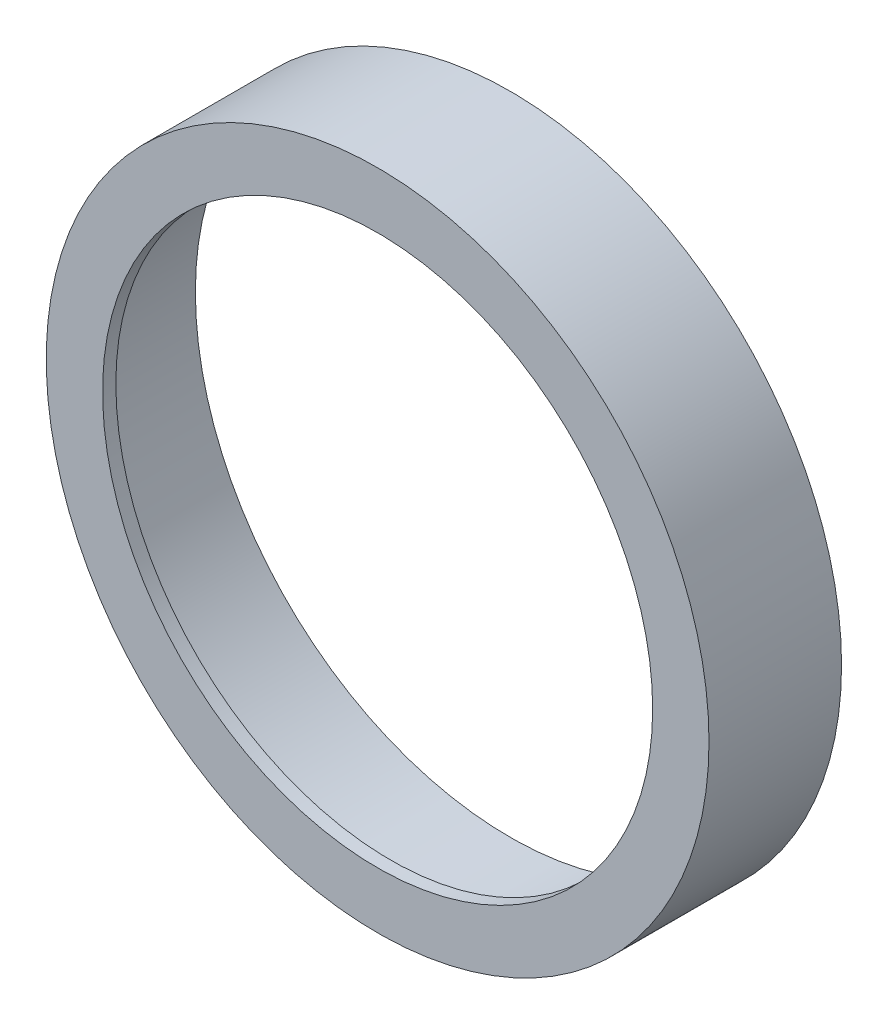
ISO-10303-21;
HEADER;
FILE_DESCRIPTION(('STEP AP214'),'2;1');
FILE_NAME('part.step','',(''),(''),'','','');
FILE_SCHEMA(('AUTOMOTIVE_DESIGN { 1 0 10303 214 1 1 1 1 }'));
ENDSEC;
DATA;
#1=APPLICATION_CONTEXT('core data for automotive mechanical design processes');
#2=APPLICATION_PROTOCOL_DEFINITION('international standard','automotive_design',2000,#1);
#3=PRODUCT_CONTEXT('',#1,'mechanical');
#4=PRODUCT('Part','Part','',(#3));
#5=PRODUCT_RELATED_PRODUCT_CATEGORY('part','',(#4));
#6=PRODUCT_DEFINITION_FORMATION('','',#4);
#7=PRODUCT_DEFINITION_CONTEXT('part definition',#1,'design');
#8=PRODUCT_DEFINITION('design','',#6,#7);
#9=PRODUCT_DEFINITION_SHAPE('','',#8);
#10=(LENGTH_UNIT() NAMED_UNIT(*) SI_UNIT(.MILLI.,.METRE.));
#11=(NAMED_UNIT(*) PLANE_ANGLE_UNIT() SI_UNIT($,.RADIAN.));
#12=(NAMED_UNIT(*) SI_UNIT($,.STERADIAN.) SOLID_ANGLE_UNIT());
#13=UNCERTAINTY_MEASURE_WITH_UNIT(LENGTH_MEASURE(1.E-05),#10,'distance_accuracy_value','');
#14=(GEOMETRIC_REPRESENTATION_CONTEXT(3) GLOBAL_UNCERTAINTY_ASSIGNED_CONTEXT((#13)) GLOBAL_UNIT_ASSIGNED_CONTEXT((#10,
#11,#12)) REPRESENTATION_CONTEXT('',''));
#15=CARTESIAN_POINT('',(0.,0.,0.));
#16=DIRECTION('',(0.,0.,1.));
#17=DIRECTION('',(1.,0.,0.));
#18=AXIS2_PLACEMENT_3D('',#15,#16,#17);
#19=CARTESIAN_POINT('',(0.,0.,0.2));
#20=DIRECTION('',(0.,0.,1.));
#21=DIRECTION('',(1.,0.,0.));
#22=AXIS2_PLACEMENT_3D('',#19,#20,#21);
#23=CYLINDRICAL_SURFACE('',#22,4.15);
#24=CARTESIAN_POINT('',(0.,0.,2.));
#25=DIRECTION('',(0.,0.,1.));
#26=DIRECTION('',(1.,0.,0.));
#27=AXIS2_PLACEMENT_3D('',#24,#25,#26);
#28=CIRCLE('',#27,4.15);
#29=CARTESIAN_POINT('',(4.15,0.,2.));
#30=VERTEX_POINT('',#29);
#31=EDGE_CURVE('E45',#30,#30,#28,.T.);
#32=ORIENTED_EDGE('',*,*,#31,.T.);
#33=EDGE_LOOP('',(#32));
#34=FACE_BOUND('',#33,.T.);
#35=CARTESIAN_POINT('',(0.,0.,1.8));
#36=DIRECTION('',(0.,0.,-1.));
#37=DIRECTION('',(-1.,0.,0.));
#38=AXIS2_PLACEMENT_3D('',#35,#36,#37);
#39=CIRCLE('',#38,4.15);
#40=CARTESIAN_POINT('',(-4.15,0.,1.8));
#41=VERTEX_POINT('',#40);
#42=EDGE_CURVE('E36',#41,#41,#39,.F.);
#43=ORIENTED_EDGE('',*,*,#42,.F.);
#44=EDGE_LOOP('',(#43));
#45=FACE_BOUND('',#44,.T.);
#46=ADVANCED_FACE('F32',(#34,#45),#23,.F.);
#47=CARTESIAN_POINT('',(0.,0.,2.));
#48=DIRECTION('',(0.,0.,-1.));
#49=DIRECTION('',(-1.,0.,0.));
#50=AXIS2_PLACEMENT_3D('',#47,#48,#49);
#51=CYLINDRICAL_SURFACE('',#50,5.);
#52=CARTESIAN_POINT('',(0.,0.,2.));
#53=DIRECTION('',(0.,0.,1.));
#54=DIRECTION('',(1.,0.,0.));
#55=AXIS2_PLACEMENT_3D('',#52,#53,#54);
#56=CIRCLE('',#55,5.);
#57=CARTESIAN_POINT('',(5.,0.,2.));
#58=VERTEX_POINT('',#57);
#59=EDGE_CURVE('E10',#58,#58,#56,.T.);
#60=ORIENTED_EDGE('',*,*,#59,.F.);
#61=EDGE_LOOP('',(#60));
#62=FACE_BOUND('',#61,.T.);
#63=CARTESIAN_POINT('',(0.,0.,0.));
#64=DIRECTION('',(0.,0.,1.));
#65=DIRECTION('',(1.,0.,0.));
#66=AXIS2_PLACEMENT_3D('',#63,#64,#65);
#67=CIRCLE('',#66,5.);
#68=CARTESIAN_POINT('',(5.,0.,0.));
#69=VERTEX_POINT('',#68);
#70=EDGE_CURVE('E40',#69,#69,#67,.T.);
#71=ORIENTED_EDGE('',*,*,#70,.T.);
#72=EDGE_LOOP('',(#71));
#73=FACE_BOUND('',#72,.T.);
#74=ADVANCED_FACE('F34',(#62,#73),#51,.T.);
#75=CARTESIAN_POINT('',(0.,0.,2.));
#76=DIRECTION('',(0.,0.,1.));
#77=DIRECTION('',(1.,0.,0.));
#78=AXIS2_PLACEMENT_3D('',#75,#76,#77);
#79=PLANE('',#78);
#80=ORIENTED_EDGE('',*,*,#31,.F.);
#81=EDGE_LOOP('',(#80));
#82=FACE_BOUND('',#81,.T.);
#83=ORIENTED_EDGE('',*,*,#59,.T.);
#84=EDGE_LOOP('',(#83));
#85=FACE_BOUND('',#84,.T.);
#86=ADVANCED_FACE('F67',(#82,#85),#79,.T.);
#87=CARTESIAN_POINT('',(0.,0.,0.));
#88=DIRECTION('',(0.,0.,1.));
#89=DIRECTION('',(1.,0.,0.));
#90=AXIS2_PLACEMENT_3D('',#87,#88,#89);
#91=PLANE('',#90);
#92=CARTESIAN_POINT('',(0.,0.,0.));
#93=DIRECTION('',(0.,0.,-1.));
#94=DIRECTION('',(-1.,0.,0.));
#95=AXIS2_PLACEMENT_3D('',#92,#93,#94);
#96=CIRCLE('',#95,4.75);
#97=CARTESIAN_POINT('',(-4.75,0.,0.));
#98=VERTEX_POINT('',#97);
#99=EDGE_CURVE('E49',#98,#98,#96,.T.);
#100=ORIENTED_EDGE('',*,*,#99,.F.);
#101=EDGE_LOOP('',(#100));
#102=FACE_BOUND('',#101,.T.);
#103=ORIENTED_EDGE('',*,*,#70,.F.);
#104=EDGE_LOOP('',(#103));
#105=FACE_BOUND('',#104,.T.);
#106=ADVANCED_FACE('F74',(#102,#105),#91,.F.);
#107=CARTESIAN_POINT('',(0.,0.,1.8));
#108=DIRECTION('',(0.,0.,-1.));
#109=DIRECTION('',(-1.,0.,0.));
#110=AXIS2_PLACEMENT_3D('',#107,#108,#109);
#111=PLANE('',#110);
#112=CARTESIAN_POINT('',(0.,0.,1.8));
#113=DIRECTION('',(0.,0.,-1.));
#114=DIRECTION('',(-1.,0.,0.));
#115=AXIS2_PLACEMENT_3D('',#112,#113,#114);
#116=CIRCLE('',#115,4.75);
#117=CARTESIAN_POINT('',(-4.75,0.,1.8));
#118=VERTEX_POINT('',#117);
#119=EDGE_CURVE('E52',#118,#118,#116,.T.);
#120=ORIENTED_EDGE('',*,*,#119,.T.);
#121=EDGE_LOOP('',(#120));
#122=FACE_BOUND('',#121,.T.);
#123=ORIENTED_EDGE('',*,*,#42,.T.);
#124=EDGE_LOOP('',(#123));
#125=FACE_BOUND('',#124,.T.);
#126=ADVANCED_FACE('F59',(#122,#125),#111,.T.);
#127=CARTESIAN_POINT('',(0.,0.,1.8));
#128=DIRECTION('',(0.,0.,-1.));
#129=DIRECTION('',(-1.,0.,0.));
#130=AXIS2_PLACEMENT_3D('',#127,#128,#129);
#131=CYLINDRICAL_SURFACE('',#130,4.75);
#132=ORIENTED_EDGE('',*,*,#119,.F.);
#133=EDGE_LOOP('',(#132));
#134=FACE_BOUND('',#133,.T.);
#135=ORIENTED_EDGE('',*,*,#99,.T.);
#136=EDGE_LOOP('',(#135));
#137=FACE_BOUND('',#136,.T.);
#138=ADVANCED_FACE('F71',(#134,#137),#131,.F.);
#139=CLOSED_SHELL('',(#46,#74,#86,#106,#126,#138));
#140=MANIFOLD_SOLID_BREP('B2',#139);
#141=ADVANCED_BREP_SHAPE_REPRESENTATION('',(#18,#140),#14);
#142=SHAPE_DEFINITION_REPRESENTATION(#9,#141);
ENDSEC;
END-ISO-10303-21;
